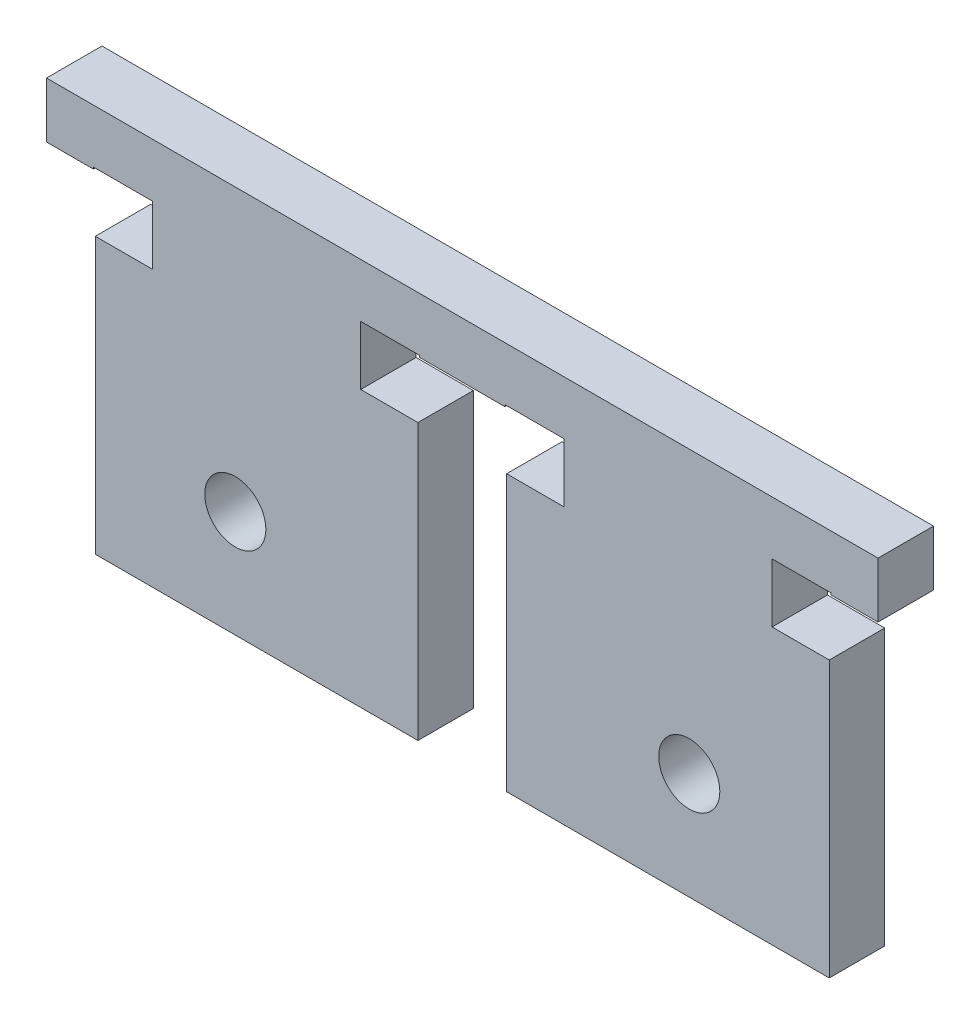
ISO-10303-21;
HEADER;
FILE_DESCRIPTION(('STEP AP214'),'2;1');
FILE_NAME('part.step','',(''),(''),'','','');
FILE_SCHEMA(('AUTOMOTIVE_DESIGN { 1 0 10303 214 1 1 1 1 }'));
ENDSEC;
DATA;
#1=APPLICATION_CONTEXT('core data for automotive mechanical design processes');
#2=APPLICATION_PROTOCOL_DEFINITION('international standard','automotive_design',2000,#1);
#3=PRODUCT_CONTEXT('',#1,'mechanical');
#4=PRODUCT('Part','Part','',(#3));
#5=PRODUCT_RELATED_PRODUCT_CATEGORY('part','',(#4));
#6=PRODUCT_DEFINITION_FORMATION('','',#4);
#7=PRODUCT_DEFINITION_CONTEXT('part definition',#1,'design');
#8=PRODUCT_DEFINITION('design','',#6,#7);
#9=PRODUCT_DEFINITION_SHAPE('','',#8);
#10=(LENGTH_UNIT() NAMED_UNIT(*) SI_UNIT(.MILLI.,.METRE.));
#11=(NAMED_UNIT(*) PLANE_ANGLE_UNIT() SI_UNIT($,.RADIAN.));
#12=(NAMED_UNIT(*) SI_UNIT($,.STERADIAN.) SOLID_ANGLE_UNIT());
#13=UNCERTAINTY_MEASURE_WITH_UNIT(LENGTH_MEASURE(1.E-05),#10,'distance_accuracy_value','');
#14=(GEOMETRIC_REPRESENTATION_CONTEXT(3) GLOBAL_UNCERTAINTY_ASSIGNED_CONTEXT((#13)) GLOBAL_UNIT_ASSIGNED_CONTEXT((#10,
#11,#12)) REPRESENTATION_CONTEXT('',''));
#15=CARTESIAN_POINT('',(0.,0.,0.));
#16=DIRECTION('',(0.,0.,1.));
#17=DIRECTION('',(1.,0.,0.));
#18=AXIS2_PLACEMENT_3D('',#15,#16,#17);
#19=CARTESIAN_POINT('',(0.,0.,6.35));
#20=DIRECTION('',(0.,0.,-1.));
#21=DIRECTION('',(-1.,0.,0.));
#22=AXIS2_PLACEMENT_3D('',#19,#20,#21);
#23=PLANE('',#22);
#24=CARTESIAN_POINT('',(-26.,-10.6279000000022,6.35));
#25=DIRECTION('',(0.,0.,1.));
#26=DIRECTION('',(1.,0.,0.));
#27=AXIS2_PLACEMENT_3D('',#24,#25,#26);
#28=CIRCLE('',#27,3.49999999999999);
#29=CARTESIAN_POINT('',(-22.5,-10.6279000000022,6.35));
#30=VERTEX_POINT('',#29);
#31=EDGE_CURVE('E694',#30,#30,#28,.T.);
#32=ORIENTED_EDGE('',*,*,#31,.F.);
#33=EDGE_LOOP('',(#32));
#34=FACE_BOUND('',#33,.T.);
#35=CARTESIAN_POINT('',(26.,-10.6279000000022,6.35));
#36=DIRECTION('',(0.,0.,1.));
#37=DIRECTION('',(1.,0.,0.));
#38=AXIS2_PLACEMENT_3D('',#35,#36,#37);
#39=CIRCLE('',#38,3.49999999999999);
#40=CARTESIAN_POINT('',(29.5,-10.6279000000022,6.35));
#41=VERTEX_POINT('',#40);
#42=EDGE_CURVE('E696',#41,#41,#39,.T.);
#43=ORIENTED_EDGE('',*,*,#42,.F.);
#44=EDGE_LOOP('',(#43));
#45=FACE_BOUND('',#44,.T.);
#46=DIRECTION('',(-1.,0.,0.));
#47=VECTOR('',#46,1.);
#48=CARTESIAN_POINT('',(-42.037,-22.86,6.35));
#49=LINE('',#48,#47);
#50=CARTESIAN_POINT('',(42.037,-22.86,6.35));
#51=VERTEX_POINT('',#50);
#52=CARTESIAN_POINT('',(5.07999999999999,-22.86,6.35));
#53=VERTEX_POINT('',#52);
#54=EDGE_CURVE('E57',#51,#53,#49,.T.);
#55=ORIENTED_EDGE('',*,*,#54,.F.);
#56=DIRECTION('',(0.,-1.,0.));
#57=VECTOR('',#56,1.);
#58=CARTESIAN_POINT('',(42.037,0.,6.35));
#59=LINE('',#58,#57);
#60=CARTESIAN_POINT('',(42.037,8.68679999999999,6.35));
#61=VERTEX_POINT('',#60);
#62=EDGE_CURVE('E270',#61,#51,#59,.T.);
#63=ORIENTED_EDGE('',*,*,#62,.F.);
#64=DIRECTION('',(-1.,0.,0.));
#65=VECTOR('',#64,1.);
#66=CARTESIAN_POINT('',(0.,8.68679999999999,6.35));
#67=LINE('',#66,#65);
#68=CARTESIAN_POINT('',(35.4838,8.68679999999999,6.35));
#69=VERTEX_POINT('',#68);
#70=EDGE_CURVE('E367',#61,#69,#67,.T.);
#71=ORIENTED_EDGE('',*,*,#70,.T.);
#72=DIRECTION('',(0.,-1.,0.));
#73=VECTOR('',#72,1.);
#74=CARTESIAN_POINT('',(35.4838,0.,6.35));
#75=LINE('',#74,#73);
#76=CARTESIAN_POINT('',(35.4838,15.4432,6.35));
#77=VERTEX_POINT('',#76);
#78=EDGE_CURVE('E364',#77,#69,#75,.T.);
#79=ORIENTED_EDGE('',*,*,#78,.F.);
#80=DIRECTION('',(-1.,0.,0.));
#81=VECTOR('',#80,1.);
#82=CARTESIAN_POINT('',(0.,15.4432,6.35));
#83=LINE('',#82,#81);
#84=CARTESIAN_POINT('',(42.2402,15.4432,6.35));
#85=VERTEX_POINT('',#84);
#86=EDGE_CURVE('E356',#85,#77,#83,.T.);
#87=ORIENTED_EDGE('',*,*,#86,.F.);
#88=DIRECTION('',(0.,-1.,0.));
#89=VECTOR('',#88,1.);
#90=CARTESIAN_POINT('',(42.2402,0.,6.35));
#91=LINE('',#90,#89);
#92=CARTESIAN_POINT('',(42.2402,15.24,6.35));
#93=VERTEX_POINT('',#92);
#94=EDGE_CURVE('E371',#85,#93,#91,.T.);
#95=ORIENTED_EDGE('',*,*,#94,.T.);
#96=DIRECTION('',(1.,0.,0.));
#97=VECTOR('',#96,1.);
#98=CARTESIAN_POINT('',(0.,15.24,6.35));
#99=LINE('',#98,#97);
#100=CARTESIAN_POINT('',(47.625,15.24,6.35));
#101=VERTEX_POINT('',#100);
#102=EDGE_CURVE('E272',#93,#101,#99,.T.);
#103=ORIENTED_EDGE('',*,*,#102,.T.);
#104=DIRECTION('',(0.,1.,0.));
#105=VECTOR('',#104,1.);
#106=CARTESIAN_POINT('',(47.625,-30.48,6.35));
#107=LINE('',#106,#105);
#108=CARTESIAN_POINT('',(47.625,21.59,6.35));
#109=VERTEX_POINT('',#108);
#110=EDGE_CURVE('E292',#101,#109,#107,.T.);
#111=ORIENTED_EDGE('',*,*,#110,.T.);
#112=DIRECTION('',(1.,0.,0.));
#113=VECTOR('',#112,1.);
#114=CARTESIAN_POINT('',(-47.625,21.59,6.35));
#115=LINE('',#114,#113);
#116=CARTESIAN_POINT('',(-47.625,21.59,6.35));
#117=VERTEX_POINT('',#116);
#118=EDGE_CURVE('E509',#117,#109,#115,.T.);
#119=ORIENTED_EDGE('',*,*,#118,.F.);
#120=DIRECTION('',(0.,-1.,0.));
#121=VECTOR('',#120,1.);
#122=CARTESIAN_POINT('',(-47.625,-30.48,6.35));
#123=LINE('',#122,#121);
#124=CARTESIAN_POINT('',(-47.625,15.24,6.35));
#125=VERTEX_POINT('',#124);
#126=EDGE_CURVE('E295',#117,#125,#123,.T.);
#127=ORIENTED_EDGE('',*,*,#126,.T.);
#128=DIRECTION('',(1.,0.,0.));
#129=VECTOR('',#128,1.);
#130=CARTESIAN_POINT('',(0.,15.24,6.35));
#131=LINE('',#130,#129);
#132=CARTESIAN_POINT('',(-42.2402,15.24,6.35));
#133=VERTEX_POINT('',#132);
#134=EDGE_CURVE('E250',#125,#133,#131,.T.);
#135=ORIENTED_EDGE('',*,*,#134,.T.);
#136=DIRECTION('',(0.,-1.,0.));
#137=VECTOR('',#136,1.);
#138=CARTESIAN_POINT('',(-42.2402,0.,6.35));
#139=LINE('',#138,#137);
#140=CARTESIAN_POINT('',(-42.2402,15.4432,6.35));
#141=VERTEX_POINT('',#140);
#142=EDGE_CURVE('E423',#141,#133,#139,.T.);
#143=ORIENTED_EDGE('',*,*,#142,.F.);
#144=DIRECTION('',(1.,0.,0.));
#145=VECTOR('',#144,1.);
#146=CARTESIAN_POINT('',(0.,15.4432,6.35));
#147=LINE('',#146,#145);
#148=CARTESIAN_POINT('',(-35.4838,15.4432,6.35));
#149=VERTEX_POINT('',#148);
#150=EDGE_CURVE('E420',#141,#149,#147,.T.);
#151=ORIENTED_EDGE('',*,*,#150,.T.);
#152=DIRECTION('',(0.,-1.,0.));
#153=VECTOR('',#152,1.);
#154=CARTESIAN_POINT('',(-35.4838,0.,6.35));
#155=LINE('',#154,#153);
#156=CARTESIAN_POINT('',(-35.4838,8.68679999999999,6.35));
#157=VERTEX_POINT('',#156);
#158=EDGE_CURVE('E346',#149,#157,#155,.T.);
#159=ORIENTED_EDGE('',*,*,#158,.T.);
#160=DIRECTION('',(1.,0.,0.));
#161=VECTOR('',#160,1.);
#162=CARTESIAN_POINT('',(0.,8.68679999999999,6.35));
#163=LINE('',#162,#161);
#164=CARTESIAN_POINT('',(-42.037,8.68679999999999,6.35));
#165=VERTEX_POINT('',#164);
#166=EDGE_CURVE('E411',#165,#157,#163,.T.);
#167=ORIENTED_EDGE('',*,*,#166,.F.);
#168=DIRECTION('',(0.,-1.,0.));
#169=VECTOR('',#168,1.);
#170=CARTESIAN_POINT('',(-42.037,0.,6.35));
#171=LINE('',#170,#169);
#172=CARTESIAN_POINT('',(-42.037,-22.86,6.35));
#173=VERTEX_POINT('',#172);
#174=EDGE_CURVE('E256',#165,#173,#171,.T.);
#175=ORIENTED_EDGE('',*,*,#174,.T.);
#176=CARTESIAN_POINT('',(-5.08000000000003,-22.86,6.35));
#177=VERTEX_POINT('',#176);
#178=EDGE_CURVE('E65',#177,#173,#49,.T.);
#179=ORIENTED_EDGE('',*,*,#178,.F.);
#180=DIRECTION('',(0.,1.,0.));
#181=VECTOR('',#180,1.);
#182=CARTESIAN_POINT('',(-5.08000000000001,0.,6.35));
#183=LINE('',#182,#181);
#184=CARTESIAN_POINT('',(-5.08000000000001,8.68680000000001,6.35));
#185=VERTEX_POINT('',#184);
#186=EDGE_CURVE('E281',#177,#185,#183,.T.);
#187=ORIENTED_EDGE('',*,*,#186,.T.);
#188=DIRECTION('',(-1.,0.,0.));
#189=VECTOR('',#188,1.);
#190=CARTESIAN_POINT('',(0.,8.68680000000001,6.35));
#191=LINE('',#190,#189);
#192=CARTESIAN_POINT('',(-11.6332,8.68680000000001,6.35));
#193=VERTEX_POINT('',#192);
#194=EDGE_CURVE('E383',#185,#193,#191,.T.);
#195=ORIENTED_EDGE('',*,*,#194,.T.);
#196=DIRECTION('',(0.,-1.,0.));
#197=VECTOR('',#196,1.);
#198=CARTESIAN_POINT('',(-11.6332,0.,6.35));
#199=LINE('',#198,#197);
#200=CARTESIAN_POINT('',(-11.6332,15.4432,6.35));
#201=VERTEX_POINT('',#200);
#202=EDGE_CURVE('E399',#201,#193,#199,.T.);
#203=ORIENTED_EDGE('',*,*,#202,.F.);
#204=DIRECTION('',(-1.,0.,0.));
#205=VECTOR('',#204,1.);
#206=CARTESIAN_POINT('',(0.,15.4432,6.35));
#207=LINE('',#206,#205);
#208=CARTESIAN_POINT('',(-4.87680000000001,15.4432,6.35));
#209=VERTEX_POINT('',#208);
#210=EDGE_CURVE('E395',#209,#201,#207,.T.);
#211=ORIENTED_EDGE('',*,*,#210,.F.);
#212=DIRECTION('',(0.,-1.,0.));
#213=VECTOR('',#212,1.);
#214=CARTESIAN_POINT('',(-4.87680000000001,0.,6.35));
#215=LINE('',#214,#213);
#216=CARTESIAN_POINT('',(-4.87680000000001,15.24,6.35));
#217=VERTEX_POINT('',#216);
#218=EDGE_CURVE('E392',#209,#217,#215,.T.);
#219=ORIENTED_EDGE('',*,*,#218,.T.);
#220=DIRECTION('',(1.,0.,0.));
#221=VECTOR('',#220,1.);
#222=CARTESIAN_POINT('',(0.,15.24,6.35));
#223=LINE('',#222,#221);
#224=CARTESIAN_POINT('',(4.87680000000001,15.24,6.35));
#225=VERTEX_POINT('',#224);
#226=EDGE_CURVE('E287',#217,#225,#223,.T.);
#227=ORIENTED_EDGE('',*,*,#226,.T.);
#228=DIRECTION('',(0.,-1.,0.));
#229=VECTOR('',#228,1.);
#230=CARTESIAN_POINT('',(4.87680000000001,0.,6.35));
#231=LINE('',#230,#229);
#232=CARTESIAN_POINT('',(4.87680000000001,15.4432,6.35));
#233=VERTEX_POINT('',#232);
#234=EDGE_CURVE('E334',#233,#225,#231,.T.);
#235=ORIENTED_EDGE('',*,*,#234,.F.);
#236=DIRECTION('',(1.,0.,0.));
#237=VECTOR('',#236,1.);
#238=CARTESIAN_POINT('',(0.,15.4432,6.35));
#239=LINE('',#238,#237);
#240=CARTESIAN_POINT('',(11.6332,15.4432,6.35));
#241=VERTEX_POINT('',#240);
#242=EDGE_CURVE('E336',#233,#241,#239,.T.);
#243=ORIENTED_EDGE('',*,*,#242,.T.);
#244=DIRECTION('',(0.,-1.,0.));
#245=VECTOR('',#244,1.);
#246=CARTESIAN_POINT('',(11.6332,0.,6.35));
#247=LINE('',#246,#245);
#248=CARTESIAN_POINT('',(11.6332,8.68680000000001,6.35));
#249=VERTEX_POINT('',#248);
#250=EDGE_CURVE('E333',#241,#249,#247,.T.);
#251=ORIENTED_EDGE('',*,*,#250,.T.);
#252=DIRECTION('',(1.,0.,0.));
#253=VECTOR('',#252,1.);
#254=CARTESIAN_POINT('',(0.,8.68680000000001,6.35));
#255=LINE('',#254,#253);
#256=CARTESIAN_POINT('',(5.07999999999999,8.68680000000001,6.35));
#257=VERTEX_POINT('',#256);
#258=EDGE_CURVE('E325',#257,#249,#255,.T.);
#259=ORIENTED_EDGE('',*,*,#258,.F.);
#260=DIRECTION('',(0.,1.,0.));
#261=VECTOR('',#260,1.);
#262=CARTESIAN_POINT('',(5.07999999999999,0.,6.35));
#263=LINE('',#262,#261);
#264=EDGE_CURVE('E285',#53,#257,#263,.T.);
#265=ORIENTED_EDGE('',*,*,#264,.F.);
#266=EDGE_LOOP('',(#55,#63,#71,#79,#87,#95,#103,#111,#119,#127,#135,#143,#151,#159,#167,#175,
#179,#187,#195,#203,#211,#219,#227,#235,#243,#251,#259,#265));
#267=FACE_BOUND('',#266,.T.);
#268=ADVANCED_FACE('F42',(#34,#45,#267),#23,.F.);
#269=CARTESIAN_POINT('',(0.,0.,0.));
#270=DIRECTION('',(0.,0.,-1.));
#271=DIRECTION('',(-1.,0.,0.));
#272=AXIS2_PLACEMENT_3D('',#269,#270,#271);
#273=PLANE('',#272);
#274=CARTESIAN_POINT('',(-26.,-10.6279000000022,0.));
#275=DIRECTION('',(0.,0.,1.));
#276=DIRECTION('',(1.,0.,0.));
#277=AXIS2_PLACEMENT_3D('',#274,#275,#276);
#278=CIRCLE('',#277,3.5);
#279=CARTESIAN_POINT('',(-22.5,-10.6279000000022,0.));
#280=VERTEX_POINT('',#279);
#281=EDGE_CURVE('E692',#280,#280,#278,.T.);
#282=ORIENTED_EDGE('',*,*,#281,.T.);
#283=EDGE_LOOP('',(#282));
#284=FACE_BOUND('',#283,.T.);
#285=CARTESIAN_POINT('',(26.,-10.6279000000022,0.));
#286=DIRECTION('',(0.,0.,1.));
#287=DIRECTION('',(1.,0.,0.));
#288=AXIS2_PLACEMENT_3D('',#285,#286,#287);
#289=CIRCLE('',#288,3.5);
#290=CARTESIAN_POINT('',(29.5,-10.6279000000022,0.));
#291=VERTEX_POINT('',#290);
#292=EDGE_CURVE('E233',#291,#291,#289,.T.);
#293=ORIENTED_EDGE('',*,*,#292,.T.);
#294=EDGE_LOOP('',(#293));
#295=FACE_BOUND('',#294,.T.);
#296=DIRECTION('',(0.,-1.,0.));
#297=VECTOR('',#296,1.);
#298=CARTESIAN_POINT('',(42.037,0.,0.));
#299=LINE('',#298,#297);
#300=CARTESIAN_POINT('',(42.037,8.68679999999999,0.));
#301=VERTEX_POINT('',#300);
#302=CARTESIAN_POINT('',(42.037,-22.86,0.));
#303=VERTEX_POINT('',#302);
#304=EDGE_CURVE('E269',#301,#303,#299,.T.);
#305=ORIENTED_EDGE('',*,*,#304,.T.);
#306=DIRECTION('',(1.,0.,0.));
#307=VECTOR('',#306,1.);
#308=CARTESIAN_POINT('',(-42.037,-22.86,0.));
#309=LINE('',#308,#307);
#310=CARTESIAN_POINT('',(5.07999999999997,-22.86,0.));
#311=VERTEX_POINT('',#310);
#312=EDGE_CURVE('E232',#311,#303,#309,.T.);
#313=ORIENTED_EDGE('',*,*,#312,.F.);
#314=DIRECTION('',(0.,1.,0.));
#315=VECTOR('',#314,1.);
#316=CARTESIAN_POINT('',(5.07999999999999,0.,0.));
#317=LINE('',#316,#315);
#318=CARTESIAN_POINT('',(5.07999999999999,8.68680000000001,0.));
#319=VERTEX_POINT('',#318);
#320=EDGE_CURVE('E278',#311,#319,#317,.T.);
#321=ORIENTED_EDGE('',*,*,#320,.T.);
#322=DIRECTION('',(1.,0.,0.));
#323=VECTOR('',#322,1.);
#324=CARTESIAN_POINT('',(0.,8.68680000000001,0.));
#325=LINE('',#324,#323);
#326=CARTESIAN_POINT('',(11.6332,8.68680000000001,0.));
#327=VERTEX_POINT('',#326);
#328=EDGE_CURVE('E328',#319,#327,#325,.T.);
#329=ORIENTED_EDGE('',*,*,#328,.T.);
#330=DIRECTION('',(0.,-1.,0.));
#331=VECTOR('',#330,1.);
#332=CARTESIAN_POINT('',(11.6332,0.,0.));
#333=LINE('',#332,#331);
#334=CARTESIAN_POINT('',(11.6332,15.4432,0.));
#335=VERTEX_POINT('',#334);
#336=EDGE_CURVE('E486',#335,#327,#333,.T.);
#337=ORIENTED_EDGE('',*,*,#336,.F.);
#338=DIRECTION('',(1.,0.,0.));
#339=VECTOR('',#338,1.);
#340=CARTESIAN_POINT('',(0.,15.4432,0.));
#341=LINE('',#340,#339);
#342=CARTESIAN_POINT('',(4.87680000000001,15.4432,0.));
#343=VERTEX_POINT('',#342);
#344=EDGE_CURVE('E351',#343,#335,#341,.T.);
#345=ORIENTED_EDGE('',*,*,#344,.F.);
#346=DIRECTION('',(0.,-1.,0.));
#347=VECTOR('',#346,1.);
#348=CARTESIAN_POINT('',(4.87680000000001,0.,0.));
#349=LINE('',#348,#347);
#350=CARTESIAN_POINT('',(4.87680000000001,15.24,0.));
#351=VERTEX_POINT('',#350);
#352=EDGE_CURVE('E343',#343,#351,#349,.T.);
#353=ORIENTED_EDGE('',*,*,#352,.T.);
#354=DIRECTION('',(1.,0.,0.));
#355=VECTOR('',#354,1.);
#356=CARTESIAN_POINT('',(0.,15.24,0.));
#357=LINE('',#356,#355);
#358=CARTESIAN_POINT('',(-4.87680000000001,15.24,0.));
#359=VERTEX_POINT('',#358);
#360=EDGE_CURVE('E280',#359,#351,#357,.T.);
#361=ORIENTED_EDGE('',*,*,#360,.F.);
#362=DIRECTION('',(0.,-1.,0.));
#363=VECTOR('',#362,1.);
#364=CARTESIAN_POINT('',(-4.87680000000001,0.,0.));
#365=LINE('',#364,#363);
#366=CARTESIAN_POINT('',(-4.87680000000001,15.4432,0.));
#367=VERTEX_POINT('',#366);
#368=EDGE_CURVE('E380',#367,#359,#365,.T.);
#369=ORIENTED_EDGE('',*,*,#368,.F.);
#370=DIRECTION('',(-1.,0.,0.));
#371=VECTOR('',#370,1.);
#372=CARTESIAN_POINT('',(0.,15.4432,0.));
#373=LINE('',#372,#371);
#374=CARTESIAN_POINT('',(-11.6332,15.4432,0.));
#375=VERTEX_POINT('',#374);
#376=EDGE_CURVE('E382',#367,#375,#373,.T.);
#377=ORIENTED_EDGE('',*,*,#376,.T.);
#378=DIRECTION('',(0.,-1.,0.));
#379=VECTOR('',#378,1.);
#380=CARTESIAN_POINT('',(-11.6332,0.,0.));
#381=LINE('',#380,#379);
#382=CARTESIAN_POINT('',(-11.6332,8.68680000000001,0.));
#383=VERTEX_POINT('',#382);
#384=EDGE_CURVE('E386',#375,#383,#381,.T.);
#385=ORIENTED_EDGE('',*,*,#384,.T.);
#386=DIRECTION('',(-1.,0.,0.));
#387=VECTOR('',#386,1.);
#388=CARTESIAN_POINT('',(0.,8.68680000000001,0.));
#389=LINE('',#388,#387);
#390=CARTESIAN_POINT('',(-5.08000000000001,8.68680000000001,0.));
#391=VERTEX_POINT('',#390);
#392=EDGE_CURVE('E389',#391,#383,#389,.T.);
#393=ORIENTED_EDGE('',*,*,#392,.F.);
#394=DIRECTION('',(0.,1.,0.));
#395=VECTOR('',#394,1.);
#396=CARTESIAN_POINT('',(-5.08000000000001,0.,0.));
#397=LINE('',#396,#395);
#398=CARTESIAN_POINT('',(-5.08000000000003,-22.86,0.));
#399=VERTEX_POINT('',#398);
#400=EDGE_CURVE('E243',#399,#391,#397,.T.);
#401=ORIENTED_EDGE('',*,*,#400,.F.);
#402=CARTESIAN_POINT('',(-42.037,-22.86,0.));
#403=VERTEX_POINT('',#402);
#404=EDGE_CURVE('E226',#403,#399,#309,.T.);
#405=ORIENTED_EDGE('',*,*,#404,.F.);
#406=DIRECTION('',(0.,-1.,0.));
#407=VECTOR('',#406,1.);
#408=CARTESIAN_POINT('',(-42.037,0.,0.));
#409=LINE('',#408,#407);
#410=CARTESIAN_POINT('',(-42.037,8.68679999999999,0.));
#411=VERTEX_POINT('',#410);
#412=EDGE_CURVE('E241',#411,#403,#409,.T.);
#413=ORIENTED_EDGE('',*,*,#412,.F.);
#414=DIRECTION('',(1.,0.,0.));
#415=VECTOR('',#414,1.);
#416=CARTESIAN_POINT('',(0.,8.68679999999999,0.));
#417=LINE('',#416,#415);
#418=CARTESIAN_POINT('',(-35.4838,8.68679999999999,0.));
#419=VERTEX_POINT('',#418);
#420=EDGE_CURVE('E416',#411,#419,#417,.T.);
#421=ORIENTED_EDGE('',*,*,#420,.T.);
#422=DIRECTION('',(0.,-1.,0.));
#423=VECTOR('',#422,1.);
#424=CARTESIAN_POINT('',(-35.4838,0.,0.));
#425=LINE('',#424,#423);
#426=CARTESIAN_POINT('',(-35.4838,15.4432,0.));
#427=VERTEX_POINT('',#426);
#428=EDGE_CURVE('E408',#427,#419,#425,.T.);
#429=ORIENTED_EDGE('',*,*,#428,.F.);
#430=DIRECTION('',(1.,0.,0.));
#431=VECTOR('',#430,1.);
#432=CARTESIAN_POINT('',(0.,15.4432,0.));
#433=LINE('',#432,#431);
#434=CARTESIAN_POINT('',(-42.2402,15.4432,0.));
#435=VERTEX_POINT('',#434);
#436=EDGE_CURVE('E410',#435,#427,#433,.T.);
#437=ORIENTED_EDGE('',*,*,#436,.F.);
#438=DIRECTION('',(0.,-1.,0.));
#439=VECTOR('',#438,1.);
#440=CARTESIAN_POINT('',(-42.2402,0.,0.));
#441=LINE('',#440,#439);
#442=CARTESIAN_POINT('',(-42.2402,15.24,0.));
#443=VERTEX_POINT('',#442);
#444=EDGE_CURVE('E413',#435,#443,#441,.T.);
#445=ORIENTED_EDGE('',*,*,#444,.T.);
#446=DIRECTION('',(1.,0.,0.));
#447=VECTOR('',#446,1.);
#448=CARTESIAN_POINT('',(0.,15.24,0.));
#449=LINE('',#448,#447);
#450=CARTESIAN_POINT('',(-47.625,15.24,0.));
#451=VERTEX_POINT('',#450);
#452=EDGE_CURVE('E249',#451,#443,#449,.T.);
#453=ORIENTED_EDGE('',*,*,#452,.F.);
#454=DIRECTION('',(0.,-1.,0.));
#455=VECTOR('',#454,1.);
#456=CARTESIAN_POINT('',(-47.625,-30.48,0.));
#457=LINE('',#456,#455);
#458=CARTESIAN_POINT('',(-47.625,21.59,0.));
#459=VERTEX_POINT('',#458);
#460=EDGE_CURVE('E296',#459,#451,#457,.T.);
#461=ORIENTED_EDGE('',*,*,#460,.F.);
#462=DIRECTION('',(-1.,0.,0.));
#463=VECTOR('',#462,1.);
#464=CARTESIAN_POINT('',(-47.625,21.59,0.));
#465=LINE('',#464,#463);
#466=CARTESIAN_POINT('',(47.625,21.59,0.));
#467=VERTEX_POINT('',#466);
#468=EDGE_CURVE('E368',#467,#459,#465,.T.);
#469=ORIENTED_EDGE('',*,*,#468,.F.);
#470=DIRECTION('',(0.,1.,0.));
#471=VECTOR('',#470,1.);
#472=CARTESIAN_POINT('',(47.625,-30.48,0.));
#473=LINE('',#472,#471);
#474=CARTESIAN_POINT('',(47.625,15.24,0.));
#475=VERTEX_POINT('',#474);
#476=EDGE_CURVE('E266',#475,#467,#473,.T.);
#477=ORIENTED_EDGE('',*,*,#476,.F.);
#478=DIRECTION('',(1.,0.,0.));
#479=VECTOR('',#478,1.);
#480=CARTESIAN_POINT('',(0.,15.24,0.));
#481=LINE('',#480,#479);
#482=CARTESIAN_POINT('',(42.2402,15.24,0.));
#483=VERTEX_POINT('',#482);
#484=EDGE_CURVE('E267',#483,#475,#481,.T.);
#485=ORIENTED_EDGE('',*,*,#484,.F.);
#486=DIRECTION('',(0.,-1.,0.));
#487=VECTOR('',#486,1.);
#488=CARTESIAN_POINT('',(42.2402,0.,0.));
#489=LINE('',#488,#487);
#490=CARTESIAN_POINT('',(42.2402,15.4432,0.));
#491=VERTEX_POINT('',#490);
#492=EDGE_CURVE('E358',#491,#483,#489,.T.);
#493=ORIENTED_EDGE('',*,*,#492,.F.);
#494=DIRECTION('',(-1.,0.,0.));
#495=VECTOR('',#494,1.);
#496=CARTESIAN_POINT('',(0.,15.4432,0.));
#497=LINE('',#496,#495);
#498=CARTESIAN_POINT('',(35.4838,15.4432,0.));
#499=VERTEX_POINT('',#498);
#500=EDGE_CURVE('E360',#491,#499,#497,.T.);
#501=ORIENTED_EDGE('',*,*,#500,.T.);
#502=DIRECTION('',(0.,-1.,0.));
#503=VECTOR('',#502,1.);
#504=CARTESIAN_POINT('',(35.4838,0.,0.));
#505=LINE('',#504,#503);
#506=CARTESIAN_POINT('',(35.4838,8.68679999999999,0.));
#507=VERTEX_POINT('',#506);
#508=EDGE_CURVE('E352',#499,#507,#505,.T.);
#509=ORIENTED_EDGE('',*,*,#508,.T.);
#510=DIRECTION('',(-1.,0.,0.));
#511=VECTOR('',#510,1.);
#512=CARTESIAN_POINT('',(0.,8.68679999999999,0.));
#513=LINE('',#512,#511);
#514=EDGE_CURVE('E355',#301,#507,#513,.T.);
#515=ORIENTED_EDGE('',*,*,#514,.F.);
#516=EDGE_LOOP('',(#305,#313,#321,#329,#337,#345,#353,#361,#369,#377,#385,#393,#401,#405,#413,
#421,#429,#437,#445,#453,#461,#469,#477,#485,#493,#501,#509,#515));
#517=FACE_BOUND('',#516,.T.);
#518=ADVANCED_FACE('F239',(#284,#295,#517),#273,.T.);
#519=CARTESIAN_POINT('',(42.037,0.,0.));
#520=DIRECTION('',(-1.,0.,0.));
#521=DIRECTION('',(0.,-1.,0.));
#522=AXIS2_PLACEMENT_3D('',#519,#520,#521);
#523=PLANE('',#522);
#524=DIRECTION('',(0.,0.,1.));
#525=VECTOR('',#524,1.);
#526=CARTESIAN_POINT('',(42.037,-22.86,6.35));
#527=LINE('',#526,#525);
#528=EDGE_CURVE('E244',#303,#51,#527,.T.);
#529=ORIENTED_EDGE('',*,*,#528,.F.);
#530=ORIENTED_EDGE('',*,*,#304,.F.);
#531=DIRECTION('',(0.,0.,-1.));
#532=VECTOR('',#531,1.);
#533=CARTESIAN_POINT('',(42.037,8.68679999999999,0.));
#534=LINE('',#533,#532);
#535=EDGE_CURVE('E310',#61,#301,#534,.T.);
#536=ORIENTED_EDGE('',*,*,#535,.F.);
#537=ORIENTED_EDGE('',*,*,#62,.T.);
#538=EDGE_LOOP('',(#529,#530,#536,#537));
#539=FACE_BOUND('',#538,.T.);
#540=ADVANCED_FACE('F545',(#539),#523,.F.);
#541=CARTESIAN_POINT('',(-5.08000000000001,0.,0.));
#542=DIRECTION('',(1.,0.,0.));
#543=DIRECTION('',(0.,0.,-1.));
#544=AXIS2_PLACEMENT_3D('',#541,#542,#543);
#545=PLANE('',#544);
#546=ORIENTED_EDGE('',*,*,#186,.F.);
#547=DIRECTION('',(0.,0.,-1.));
#548=VECTOR('',#547,1.);
#549=CARTESIAN_POINT('',(-5.08000000000001,-22.86,0.));
#550=LINE('',#549,#548);
#551=EDGE_CURVE('E458',#177,#399,#550,.T.);
#552=ORIENTED_EDGE('',*,*,#551,.T.);
#553=ORIENTED_EDGE('',*,*,#400,.T.);
#554=DIRECTION('',(0.,0.,1.));
#555=VECTOR('',#554,1.);
#556=CARTESIAN_POINT('',(-5.08000000000001,8.68680000000001,0.));
#557=LINE('',#556,#555);
#558=EDGE_CURVE('E307',#391,#185,#557,.T.);
#559=ORIENTED_EDGE('',*,*,#558,.T.);
#560=EDGE_LOOP('',(#546,#552,#553,#559));
#561=FACE_BOUND('',#560,.T.);
#562=ADVANCED_FACE('F457',(#561),#545,.T.);
#563=CARTESIAN_POINT('',(5.07999999999999,0.,0.));
#564=DIRECTION('',(1.,0.,0.));
#565=DIRECTION('',(0.,0.,-1.));
#566=AXIS2_PLACEMENT_3D('',#563,#564,#565);
#567=PLANE('',#566);
#568=DIRECTION('',(0.,0.,-1.));
#569=VECTOR('',#568,1.);
#570=CARTESIAN_POINT('',(5.07999999999999,-22.86,0.));
#571=LINE('',#570,#569);
#572=EDGE_CURVE('E504',#53,#311,#571,.T.);
#573=ORIENTED_EDGE('',*,*,#572,.F.);
#574=ORIENTED_EDGE('',*,*,#264,.T.);
#575=DIRECTION('',(0.,0.,-1.));
#576=VECTOR('',#575,1.);
#577=CARTESIAN_POINT('',(5.07999999999999,8.68680000000001,0.));
#578=LINE('',#577,#576);
#579=EDGE_CURVE('E50',#257,#319,#578,.T.);
#580=ORIENTED_EDGE('',*,*,#579,.T.);
#581=ORIENTED_EDGE('',*,*,#320,.F.);
#582=EDGE_LOOP('',(#573,#574,#580,#581));
#583=FACE_BOUND('',#582,.T.);
#584=ADVANCED_FACE('F318',(#583),#567,.F.);
#585=CARTESIAN_POINT('',(-42.037,0.,0.));
#586=DIRECTION('',(-1.,0.,0.));
#587=DIRECTION('',(0.,-1.,0.));
#588=AXIS2_PLACEMENT_3D('',#585,#586,#587);
#589=PLANE('',#588);
#590=ORIENTED_EDGE('',*,*,#412,.T.);
#591=DIRECTION('',(0.,0.,-1.));
#592=VECTOR('',#591,1.);
#593=CARTESIAN_POINT('',(-42.037,-22.86,6.35));
#594=LINE('',#593,#592);
#595=EDGE_CURVE('E223',#173,#403,#594,.T.);
#596=ORIENTED_EDGE('',*,*,#595,.F.);
#597=ORIENTED_EDGE('',*,*,#174,.F.);
#598=DIRECTION('',(0.,0.,1.));
#599=VECTOR('',#598,1.);
#600=CARTESIAN_POINT('',(-42.037,8.68679999999999,0.));
#601=LINE('',#600,#599);
#602=EDGE_CURVE('E248',#411,#165,#601,.T.);
#603=ORIENTED_EDGE('',*,*,#602,.F.);
#604=EDGE_LOOP('',(#590,#596,#597,#603));
#605=FACE_BOUND('',#604,.T.);
#606=ADVANCED_FACE('F247',(#605),#589,.T.);
#607=CARTESIAN_POINT('',(47.625,-30.48,6.35));
#608=DIRECTION('',(-1.,0.,0.));
#609=DIRECTION('',(0.,0.,1.));
#610=AXIS2_PLACEMENT_3D('',#607,#608,#609);
#611=PLANE('',#610);
#612=DIRECTION('',(0.,0.,-1.));
#613=VECTOR('',#612,1.);
#614=CARTESIAN_POINT('',(47.625,21.59,0.));
#615=LINE('',#614,#613);
#616=EDGE_CURVE('E510',#109,#467,#615,.T.);
#617=ORIENTED_EDGE('',*,*,#616,.F.);
#618=ORIENTED_EDGE('',*,*,#110,.F.);
#619=DIRECTION('',(0.,0.,1.));
#620=VECTOR('',#619,1.);
#621=CARTESIAN_POINT('',(47.625,15.24,0.));
#622=LINE('',#621,#620);
#623=EDGE_CURVE('E262',#475,#101,#622,.T.);
#624=ORIENTED_EDGE('',*,*,#623,.F.);
#625=ORIENTED_EDGE('',*,*,#476,.T.);
#626=EDGE_LOOP('',(#617,#618,#624,#625));
#627=FACE_BOUND('',#626,.T.);
#628=ADVANCED_FACE('F44',(#627),#611,.F.);
#629=CARTESIAN_POINT('',(-47.625,-30.48,6.35));
#630=DIRECTION('',(1.,0.,0.));
#631=DIRECTION('',(0.,0.,-1.));
#632=AXIS2_PLACEMENT_3D('',#629,#630,#631);
#633=PLANE('',#632);
#634=DIRECTION('',(0.,0.,1.));
#635=VECTOR('',#634,1.);
#636=CARTESIAN_POINT('',(-47.625,21.59,0.));
#637=LINE('',#636,#635);
#638=EDGE_CURVE('E507',#459,#117,#637,.T.);
#639=ORIENTED_EDGE('',*,*,#638,.F.);
#640=ORIENTED_EDGE('',*,*,#460,.T.);
#641=DIRECTION('',(0.,0.,1.));
#642=VECTOR('',#641,1.);
#643=CARTESIAN_POINT('',(-47.625,15.24,0.));
#644=LINE('',#643,#642);
#645=EDGE_CURVE('E253',#451,#125,#644,.T.);
#646=ORIENTED_EDGE('',*,*,#645,.T.);
#647=ORIENTED_EDGE('',*,*,#126,.F.);
#648=EDGE_LOOP('',(#639,#640,#646,#647));
#649=FACE_BOUND('',#648,.T.);
#650=ADVANCED_FACE('F519',(#649),#633,.F.);
#651=CARTESIAN_POINT('',(0.,15.24,0.));
#652=DIRECTION('',(0.,-1.,0.));
#653=DIRECTION('',(1.,0.,0.));
#654=AXIS2_PLACEMENT_3D('',#651,#652,#653);
#655=PLANE('',#654);
#656=ORIENTED_EDGE('',*,*,#102,.F.);
#657=DIRECTION('',(0.,0.,-1.));
#658=VECTOR('',#657,1.);
#659=CARTESIAN_POINT('',(42.2402,15.24,0.));
#660=LINE('',#659,#658);
#661=EDGE_CURVE('E312',#93,#483,#660,.T.);
#662=ORIENTED_EDGE('',*,*,#661,.T.);
#663=ORIENTED_EDGE('',*,*,#484,.T.);
#664=ORIENTED_EDGE('',*,*,#623,.T.);
#665=EDGE_LOOP('',(#656,#662,#663,#664));
#666=FACE_BOUND('',#665,.T.);
#667=ADVANCED_FACE('F527',(#666),#655,.T.);
#668=CARTESIAN_POINT('',(0.,15.24,0.));
#669=DIRECTION('',(0.,-1.,0.));
#670=DIRECTION('',(1.,0.,0.));
#671=AXIS2_PLACEMENT_3D('',#668,#669,#670);
#672=PLANE('',#671);
#673=DIRECTION('',(0.,0.,-1.));
#674=VECTOR('',#673,1.);
#675=CARTESIAN_POINT('',(4.87680000000001,15.24,0.));
#676=LINE('',#675,#674);
#677=EDGE_CURVE('E11',#225,#351,#676,.T.);
#678=ORIENTED_EDGE('',*,*,#677,.F.);
#679=ORIENTED_EDGE('',*,*,#226,.F.);
#680=DIRECTION('',(0.,0.,-1.));
#681=VECTOR('',#680,1.);
#682=CARTESIAN_POINT('',(-4.87680000000001,15.24,0.));
#683=LINE('',#682,#681);
#684=EDGE_CURVE('E304',#217,#359,#683,.T.);
#685=ORIENTED_EDGE('',*,*,#684,.T.);
#686=ORIENTED_EDGE('',*,*,#360,.T.);
#687=EDGE_LOOP('',(#678,#679,#685,#686));
#688=FACE_BOUND('',#687,.T.);
#689=ADVANCED_FACE('F479',(#688),#672,.T.);
#690=CARTESIAN_POINT('',(0.,15.24,0.));
#691=DIRECTION('',(0.,-1.,0.));
#692=DIRECTION('',(1.,0.,0.));
#693=AXIS2_PLACEMENT_3D('',#690,#691,#692);
#694=PLANE('',#693);
#695=DIRECTION('',(0.,0.,-1.));
#696=VECTOR('',#695,1.);
#697=CARTESIAN_POINT('',(-42.2402,15.24,0.));
#698=LINE('',#697,#696);
#699=EDGE_CURVE('E298',#133,#443,#698,.T.);
#700=ORIENTED_EDGE('',*,*,#699,.F.);
#701=ORIENTED_EDGE('',*,*,#134,.F.);
#702=ORIENTED_EDGE('',*,*,#645,.F.);
#703=ORIENTED_EDGE('',*,*,#452,.T.);
#704=EDGE_LOOP('',(#700,#701,#702,#703));
#705=FACE_BOUND('',#704,.T.);
#706=ADVANCED_FACE('F446',(#705),#694,.T.);
#707=CARTESIAN_POINT('',(-35.4838,0.,0.));
#708=DIRECTION('',(-1.,0.,0.));
#709=DIRECTION('',(0.,0.,1.));
#710=AXIS2_PLACEMENT_3D('',#707,#708,#709);
#711=PLANE('',#710);
#712=ORIENTED_EDGE('',*,*,#158,.F.);
#713=DIRECTION('',(0.,0.,1.));
#714=VECTOR('',#713,1.);
#715=CARTESIAN_POINT('',(-35.4838,15.4432,0.));
#716=LINE('',#715,#714);
#717=EDGE_CURVE('E259',#427,#149,#716,.T.);
#718=ORIENTED_EDGE('',*,*,#717,.F.);
#719=ORIENTED_EDGE('',*,*,#428,.T.);
#720=DIRECTION('',(0.,0.,1.));
#721=VECTOR('',#720,1.);
#722=CARTESIAN_POINT('',(-35.4838,8.68679999999999,0.));
#723=LINE('',#722,#721);
#724=EDGE_CURVE('E396',#419,#157,#723,.T.);
#725=ORIENTED_EDGE('',*,*,#724,.T.);
#726=EDGE_LOOP('',(#712,#718,#719,#725));
#727=FACE_BOUND('',#726,.T.);
#728=ADVANCED_FACE('F439',(#727),#711,.T.);
#729=CARTESIAN_POINT('',(0.,8.68679999999999,0.));
#730=DIRECTION('',(0.,-1.,0.));
#731=DIRECTION('',(0.,0.,-1.));
#732=AXIS2_PLACEMENT_3D('',#729,#730,#731);
#733=PLANE('',#732);
#734=ORIENTED_EDGE('',*,*,#602,.T.);
#735=ORIENTED_EDGE('',*,*,#166,.T.);
#736=ORIENTED_EDGE('',*,*,#724,.F.);
#737=ORIENTED_EDGE('',*,*,#420,.F.);
#738=EDGE_LOOP('',(#734,#735,#736,#737));
#739=FACE_BOUND('',#738,.T.);
#740=ADVANCED_FACE('F452',(#739),#733,.F.);
#741=CARTESIAN_POINT('',(-42.2402,0.,0.));
#742=DIRECTION('',(-1.,0.,0.));
#743=DIRECTION('',(0.,0.,1.));
#744=AXIS2_PLACEMENT_3D('',#741,#742,#743);
#745=PLANE('',#744);
#746=ORIENTED_EDGE('',*,*,#699,.T.);
#747=ORIENTED_EDGE('',*,*,#444,.F.);
#748=DIRECTION('',(0.,0.,1.));
#749=VECTOR('',#748,1.);
#750=CARTESIAN_POINT('',(-42.2402,15.4432,0.));
#751=LINE('',#750,#749);
#752=EDGE_CURVE('E427',#435,#141,#751,.T.);
#753=ORIENTED_EDGE('',*,*,#752,.T.);
#754=ORIENTED_EDGE('',*,*,#142,.T.);
#755=EDGE_LOOP('',(#746,#747,#753,#754));
#756=FACE_BOUND('',#755,.T.);
#757=ADVANCED_FACE('F444',(#756),#745,.F.);
#758=CARTESIAN_POINT('',(0.,15.4432,0.));
#759=DIRECTION('',(0.,-1.,0.));
#760=DIRECTION('',(0.,0.,-1.));
#761=AXIS2_PLACEMENT_3D('',#758,#759,#760);
#762=PLANE('',#761);
#763=ORIENTED_EDGE('',*,*,#150,.F.);
#764=ORIENTED_EDGE('',*,*,#752,.F.);
#765=ORIENTED_EDGE('',*,*,#436,.T.);
#766=ORIENTED_EDGE('',*,*,#717,.T.);
#767=EDGE_LOOP('',(#763,#764,#765,#766));
#768=FACE_BOUND('',#767,.T.);
#769=ADVANCED_FACE('F434',(#768),#762,.T.);
#770=CARTESIAN_POINT('',(-4.87680000000001,0.,0.));
#771=DIRECTION('',(-1.,0.,0.));
#772=DIRECTION('',(0.,-1.,0.));
#773=AXIS2_PLACEMENT_3D('',#770,#771,#772);
#774=PLANE('',#773);
#775=ORIENTED_EDGE('',*,*,#218,.F.);
#776=DIRECTION('',(0.,0.,1.));
#777=VECTOR('',#776,1.);
#778=CARTESIAN_POINT('',(-4.87680000000001,15.4432,0.));
#779=LINE('',#778,#777);
#780=EDGE_CURVE('E391',#367,#209,#779,.T.);
#781=ORIENTED_EDGE('',*,*,#780,.F.);
#782=ORIENTED_EDGE('',*,*,#368,.T.);
#783=ORIENTED_EDGE('',*,*,#684,.F.);
#784=EDGE_LOOP('',(#775,#781,#782,#783));
#785=FACE_BOUND('',#784,.T.);
#786=ADVANCED_FACE('F475',(#785),#774,.T.);
#787=CARTESIAN_POINT('',(0.,8.68680000000001,0.));
#788=DIRECTION('',(0.,1.,0.));
#789=DIRECTION('',(0.,0.,1.));
#790=AXIS2_PLACEMENT_3D('',#787,#788,#789);
#791=PLANE('',#790);
#792=ORIENTED_EDGE('',*,*,#392,.T.);
#793=DIRECTION('',(0.,0.,1.));
#794=VECTOR('',#793,1.);
#795=CARTESIAN_POINT('',(-11.6332,8.68680000000001,0.));
#796=LINE('',#795,#794);
#797=EDGE_CURVE('E288',#383,#193,#796,.T.);
#798=ORIENTED_EDGE('',*,*,#797,.T.);
#799=ORIENTED_EDGE('',*,*,#194,.F.);
#800=ORIENTED_EDGE('',*,*,#558,.F.);
#801=EDGE_LOOP('',(#792,#798,#799,#800));
#802=FACE_BOUND('',#801,.T.);
#803=ADVANCED_FACE('F461',(#802),#791,.T.);
#804=CARTESIAN_POINT('',(-11.6332,0.,0.));
#805=DIRECTION('',(-1.,0.,0.));
#806=DIRECTION('',(0.,0.,1.));
#807=AXIS2_PLACEMENT_3D('',#804,#805,#806);
#808=PLANE('',#807);
#809=ORIENTED_EDGE('',*,*,#202,.T.);
#810=ORIENTED_EDGE('',*,*,#797,.F.);
#811=ORIENTED_EDGE('',*,*,#384,.F.);
#812=DIRECTION('',(0.,0.,1.));
#813=VECTOR('',#812,1.);
#814=CARTESIAN_POINT('',(-11.6332,15.4432,0.));
#815=LINE('',#814,#813);
#816=EDGE_CURVE('E405',#375,#201,#815,.T.);
#817=ORIENTED_EDGE('',*,*,#816,.T.);
#818=EDGE_LOOP('',(#809,#810,#811,#817));
#819=FACE_BOUND('',#818,.T.);
#820=ADVANCED_FACE('F467',(#819),#808,.F.);
#821=CARTESIAN_POINT('',(0.,15.4432,0.));
#822=DIRECTION('',(0.,1.,0.));
#823=DIRECTION('',(-1.,0.,0.));
#824=AXIS2_PLACEMENT_3D('',#821,#822,#823);
#825=PLANE('',#824);
#826=ORIENTED_EDGE('',*,*,#210,.T.);
#827=ORIENTED_EDGE('',*,*,#816,.F.);
#828=ORIENTED_EDGE('',*,*,#376,.F.);
#829=ORIENTED_EDGE('',*,*,#780,.T.);
#830=EDGE_LOOP('',(#826,#827,#828,#829));
#831=FACE_BOUND('',#830,.T.);
#832=ADVANCED_FACE('F473',(#831),#825,.F.);
#833=CARTESIAN_POINT('',(0.,8.68679999999999,0.));
#834=DIRECTION('',(0.,1.,0.));
#835=DIRECTION('',(0.,0.,1.));
#836=AXIS2_PLACEMENT_3D('',#833,#834,#835);
#837=PLANE('',#836);
#838=ORIENTED_EDGE('',*,*,#535,.T.);
#839=ORIENTED_EDGE('',*,*,#514,.T.);
#840=DIRECTION('',(0.,0.,1.));
#841=VECTOR('',#840,1.);
#842=CARTESIAN_POINT('',(35.4838,8.68679999999999,0.));
#843=LINE('',#842,#841);
#844=EDGE_CURVE('E363',#507,#69,#843,.T.);
#845=ORIENTED_EDGE('',*,*,#844,.T.);
#846=ORIENTED_EDGE('',*,*,#70,.F.);
#847=EDGE_LOOP('',(#838,#839,#845,#846));
#848=FACE_BOUND('',#847,.T.);
#849=ADVANCED_FACE('F541',(#848),#837,.T.);
#850=CARTESIAN_POINT('',(35.4838,0.,0.));
#851=DIRECTION('',(-1.,0.,0.));
#852=DIRECTION('',(0.,0.,1.));
#853=AXIS2_PLACEMENT_3D('',#850,#851,#852);
#854=PLANE('',#853);
#855=ORIENTED_EDGE('',*,*,#78,.T.);
#856=ORIENTED_EDGE('',*,*,#844,.F.);
#857=ORIENTED_EDGE('',*,*,#508,.F.);
#858=DIRECTION('',(0.,0.,1.));
#859=VECTOR('',#858,1.);
#860=CARTESIAN_POINT('',(35.4838,15.4432,0.));
#861=LINE('',#860,#859);
#862=EDGE_CURVE('E338',#499,#77,#861,.T.);
#863=ORIENTED_EDGE('',*,*,#862,.T.);
#864=EDGE_LOOP('',(#855,#856,#857,#863));
#865=FACE_BOUND('',#864,.T.);
#866=ADVANCED_FACE('F539',(#865),#854,.F.);
#867=CARTESIAN_POINT('',(0.,15.4432,0.));
#868=DIRECTION('',(0.,1.,0.));
#869=DIRECTION('',(0.,0.,1.));
#870=AXIS2_PLACEMENT_3D('',#867,#868,#869);
#871=PLANE('',#870);
#872=ORIENTED_EDGE('',*,*,#86,.T.);
#873=ORIENTED_EDGE('',*,*,#862,.F.);
#874=ORIENTED_EDGE('',*,*,#500,.F.);
#875=DIRECTION('',(0.,0.,1.));
#876=VECTOR('',#875,1.);
#877=CARTESIAN_POINT('',(42.2402,15.4432,0.));
#878=LINE('',#877,#876);
#879=EDGE_CURVE('E377',#491,#85,#878,.T.);
#880=ORIENTED_EDGE('',*,*,#879,.T.);
#881=EDGE_LOOP('',(#872,#873,#874,#880));
#882=FACE_BOUND('',#881,.T.);
#883=ADVANCED_FACE('F534',(#882),#871,.F.);
#884=CARTESIAN_POINT('',(42.2402,0.,0.));
#885=DIRECTION('',(-1.,0.,0.));
#886=DIRECTION('',(0.,0.,1.));
#887=AXIS2_PLACEMENT_3D('',#884,#885,#886);
#888=PLANE('',#887);
#889=ORIENTED_EDGE('',*,*,#94,.F.);
#890=ORIENTED_EDGE('',*,*,#879,.F.);
#891=ORIENTED_EDGE('',*,*,#492,.T.);
#892=ORIENTED_EDGE('',*,*,#661,.F.);
#893=EDGE_LOOP('',(#889,#890,#891,#892));
#894=FACE_BOUND('',#893,.T.);
#895=ADVANCED_FACE('F530',(#894),#888,.T.);
#896=CARTESIAN_POINT('',(0.,8.68680000000001,0.));
#897=DIRECTION('',(0.,-1.,0.));
#898=DIRECTION('',(0.,0.,-1.));
#899=AXIS2_PLACEMENT_3D('',#896,#897,#898);
#900=PLANE('',#899);
#901=ORIENTED_EDGE('',*,*,#258,.T.);
#902=DIRECTION('',(0.,0.,1.));
#903=VECTOR('',#902,1.);
#904=CARTESIAN_POINT('',(11.6332,8.68680000000001,0.));
#905=LINE('',#904,#903);
#906=EDGE_CURVE('E349',#327,#249,#905,.T.);
#907=ORIENTED_EDGE('',*,*,#906,.F.);
#908=ORIENTED_EDGE('',*,*,#328,.F.);
#909=ORIENTED_EDGE('',*,*,#579,.F.);
#910=EDGE_LOOP('',(#901,#907,#908,#909));
#911=FACE_BOUND('',#910,.T.);
#912=ADVANCED_FACE('F323',(#911),#900,.F.);
#913=CARTESIAN_POINT('',(4.87680000000001,0.,0.));
#914=DIRECTION('',(-1.,0.,0.));
#915=DIRECTION('',(0.,-1.,0.));
#916=AXIS2_PLACEMENT_3D('',#913,#914,#915);
#917=PLANE('',#916);
#918=ORIENTED_EDGE('',*,*,#677,.T.);
#919=ORIENTED_EDGE('',*,*,#352,.F.);
#920=DIRECTION('',(0.,0.,1.));
#921=VECTOR('',#920,1.);
#922=CARTESIAN_POINT('',(4.87680000000001,15.4432,0.));
#923=LINE('',#922,#921);
#924=EDGE_CURVE('E344',#343,#233,#923,.T.);
#925=ORIENTED_EDGE('',*,*,#924,.T.);
#926=ORIENTED_EDGE('',*,*,#234,.T.);
#927=EDGE_LOOP('',(#918,#919,#925,#926));
#928=FACE_BOUND('',#927,.T.);
#929=ADVANCED_FACE('F623',(#928),#917,.F.);
#930=CARTESIAN_POINT('',(0.,15.4432,0.));
#931=DIRECTION('',(0.,-1.,0.));
#932=DIRECTION('',(1.,0.,0.));
#933=AXIS2_PLACEMENT_3D('',#930,#931,#932);
#934=PLANE('',#933);
#935=ORIENTED_EDGE('',*,*,#242,.F.);
#936=ORIENTED_EDGE('',*,*,#924,.F.);
#937=ORIENTED_EDGE('',*,*,#344,.T.);
#938=DIRECTION('',(0.,0.,1.));
#939=VECTOR('',#938,1.);
#940=CARTESIAN_POINT('',(11.6332,15.4432,0.));
#941=LINE('',#940,#939);
#942=EDGE_CURVE('E347',#335,#241,#941,.T.);
#943=ORIENTED_EDGE('',*,*,#942,.T.);
#944=EDGE_LOOP('',(#935,#936,#937,#943));
#945=FACE_BOUND('',#944,.T.);
#946=ADVANCED_FACE('F494',(#945),#934,.T.);
#947=CARTESIAN_POINT('',(11.6332,0.,0.));
#948=DIRECTION('',(-1.,0.,0.));
#949=DIRECTION('',(0.,0.,1.));
#950=AXIS2_PLACEMENT_3D('',#947,#948,#949);
#951=PLANE('',#950);
#952=ORIENTED_EDGE('',*,*,#250,.F.);
#953=ORIENTED_EDGE('',*,*,#942,.F.);
#954=ORIENTED_EDGE('',*,*,#336,.T.);
#955=ORIENTED_EDGE('',*,*,#906,.T.);
#956=EDGE_LOOP('',(#952,#953,#954,#955));
#957=FACE_BOUND('',#956,.T.);
#958=ADVANCED_FACE('F496',(#957),#951,.T.);
#959=CARTESIAN_POINT('',(0.,21.59,0.));
#960=DIRECTION('',(0.,1.,0.));
#961=DIRECTION('',(0.,0.,1.));
#962=AXIS2_PLACEMENT_3D('',#959,#960,#961);
#963=PLANE('',#962);
#964=ORIENTED_EDGE('',*,*,#638,.T.);
#965=ORIENTED_EDGE('',*,*,#118,.T.);
#966=ORIENTED_EDGE('',*,*,#616,.T.);
#967=ORIENTED_EDGE('',*,*,#468,.T.);
#968=EDGE_LOOP('',(#964,#965,#966,#967));
#969=FACE_BOUND('',#968,.T.);
#970=ADVANCED_FACE('F514',(#969),#963,.T.);
#971=CARTESIAN_POINT('',(0.,-22.86,0.));
#972=DIRECTION('',(0.,-1.,0.));
#973=DIRECTION('',(0.,0.,-1.));
#974=AXIS2_PLACEMENT_3D('',#971,#972,#973);
#975=PLANE('',#974);
#976=ORIENTED_EDGE('',*,*,#178,.T.);
#977=ORIENTED_EDGE('',*,*,#595,.T.);
#978=ORIENTED_EDGE('',*,*,#404,.T.);
#979=ORIENTED_EDGE('',*,*,#551,.F.);
#980=EDGE_LOOP('',(#976,#977,#978,#979));
#981=FACE_BOUND('',#980,.T.);
#982=ADVANCED_FACE('F225',(#981),#975,.T.);
#983=ORIENTED_EDGE('',*,*,#572,.T.);
#984=ORIENTED_EDGE('',*,*,#312,.T.);
#985=ORIENTED_EDGE('',*,*,#528,.T.);
#986=ORIENTED_EDGE('',*,*,#54,.T.);
#987=EDGE_LOOP('',(#983,#984,#985,#986));
#988=FACE_BOUND('',#987,.T.);
#989=ADVANCED_FACE('F546',(#988),#975,.T.);
#990=CARTESIAN_POINT('',(26.,-10.6279000000022,6.35));
#991=DIRECTION('',(0.,0.,1.));
#992=DIRECTION('',(1.,0.,0.));
#993=AXIS2_PLACEMENT_3D('',#990,#991,#992);
#994=CYLINDRICAL_SURFACE('',#993,3.49999999999999);
#995=ORIENTED_EDGE('',*,*,#292,.F.);
#996=EDGE_LOOP('',(#995));
#997=FACE_BOUND('',#996,.T.);
#998=ORIENTED_EDGE('',*,*,#42,.T.);
#999=EDGE_LOOP('',(#998));
#1000=FACE_BOUND('',#999,.T.);
#1001=ADVANCED_FACE('F548',(#997,#1000),#994,.F.);
#1002=CARTESIAN_POINT('',(-26.,-10.6279000000022,6.35));
#1003=DIRECTION('',(0.,0.,1.));
#1004=DIRECTION('',(1.,0.,0.));
#1005=AXIS2_PLACEMENT_3D('',#1002,#1003,#1004);
#1006=CYLINDRICAL_SURFACE('',#1005,3.49999999999999);
#1007=ORIENTED_EDGE('',*,*,#281,.F.);
#1008=EDGE_LOOP('',(#1007));
#1009=FACE_BOUND('',#1008,.T.);
#1010=ORIENTED_EDGE('',*,*,#31,.T.);
#1011=EDGE_LOOP('',(#1010));
#1012=FACE_BOUND('',#1011,.T.);
#1013=ADVANCED_FACE('F555',(#1009,#1012),#1006,.F.);
#1014=CLOSED_SHELL('',(#268,#518,#540,#562,#584,#606,#628,#650,#667,#689,#706,#728,#740,#757,
#769,#786,#803,#820,#832,#849,#866,#883,#895,#912,#929,#946,#958,#970,#982,#989,#1001,#1013));
#1015=MANIFOLD_SOLID_BREP('B2',#1014);
#1016=ADVANCED_BREP_SHAPE_REPRESENTATION('',(#18,#1015),#14);
#1017=SHAPE_DEFINITION_REPRESENTATION(#9,#1016);
ENDSEC;
END-ISO-10303-21;
